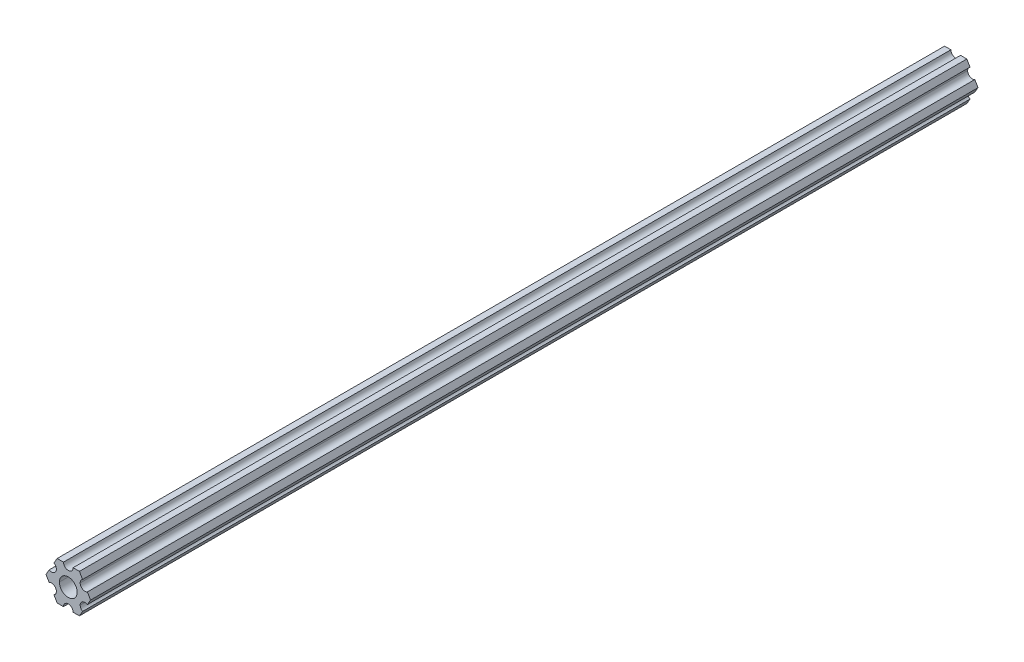
ISO-10303-21;
HEADER;
FILE_DESCRIPTION(('STEP AP214'),'2;1');
FILE_NAME('part.step','',(''),(''),'','','');
FILE_SCHEMA(('AUTOMOTIVE_DESIGN { 1 0 10303 214 1 1 1 1 }'));
ENDSEC;
DATA;
#1=APPLICATION_CONTEXT('core data for automotive mechanical design processes');
#2=APPLICATION_PROTOCOL_DEFINITION('international standard','automotive_design',2000,#1);
#3=PRODUCT_CONTEXT('',#1,'mechanical');
#4=PRODUCT('Part','Part','',(#3));
#5=PRODUCT_RELATED_PRODUCT_CATEGORY('part','',(#4));
#6=PRODUCT_DEFINITION_FORMATION('','',#4);
#7=PRODUCT_DEFINITION_CONTEXT('part definition',#1,'design');
#8=PRODUCT_DEFINITION('design','',#6,#7);
#9=PRODUCT_DEFINITION_SHAPE('','',#8);
#10=(LENGTH_UNIT() NAMED_UNIT(*) SI_UNIT(.MILLI.,.METRE.));
#11=(NAMED_UNIT(*) PLANE_ANGLE_UNIT() SI_UNIT($,.RADIAN.));
#12=(NAMED_UNIT(*) SI_UNIT($,.STERADIAN.) SOLID_ANGLE_UNIT());
#13=UNCERTAINTY_MEASURE_WITH_UNIT(LENGTH_MEASURE(1.E-05),#10,'distance_accuracy_value','');
#14=(GEOMETRIC_REPRESENTATION_CONTEXT(3) GLOBAL_UNCERTAINTY_ASSIGNED_CONTEXT((#13)) GLOBAL_UNIT_ASSIGNED_CONTEXT((#10,
#11,#12)) REPRESENTATION_CONTEXT('',''));
#15=CARTESIAN_POINT('',(0.,0.,0.));
#16=DIRECTION('',(0.,0.,1.));
#17=DIRECTION('',(1.,0.,0.));
#18=AXIS2_PLACEMENT_3D('',#15,#16,#17);
#19=CARTESIAN_POINT('',(0.,0.,304.8));
#20=DIRECTION('',(0.,0.,-1.));
#21=DIRECTION('',(-1.,0.,0.));
#22=AXIS2_PLACEMENT_3D('',#19,#20,#21);
#23=CYLINDRICAL_SURFACE('',#22,2.9337);
#24=DIRECTION('',(0.,0.,-1.));
#25=VECTOR('',#24,1.);
#26=CARTESIAN_POINT('',(2.9337,0.,304.8));
#27=LINE('',#26,#25);
#28=CARTESIAN_POINT('',(2.9337,0.,292.1));
#29=VERTEX_POINT('',#28);
#30=CARTESIAN_POINT('',(2.9337,0.,0.));
#31=VERTEX_POINT('',#30);
#32=EDGE_CURVE('E320',#29,#31,#27,.T.);
#33=ORIENTED_EDGE('',*,*,#32,.F.);
#34=CARTESIAN_POINT('',(0.,0.,292.1));
#35=DIRECTION('',(0.,0.,-1.));
#36=DIRECTION('',(-1.,0.,0.));
#37=AXIS2_PLACEMENT_3D('',#34,#35,#36);
#38=CIRCLE('',#37,2.9337);
#39=CARTESIAN_POINT('',(-2.9337,0.,292.1));
#40=VERTEX_POINT('',#39);
#41=EDGE_CURVE('E68',#29,#40,#38,.F.);
#42=ORIENTED_EDGE('',*,*,#41,.T.);
#43=DIRECTION('',(0.,0.,-1.));
#44=VECTOR('',#43,1.);
#45=CARTESIAN_POINT('',(-2.9337,0.,304.8));
#46=LINE('',#45,#44);
#47=CARTESIAN_POINT('',(-2.9337,0.,0.));
#48=VERTEX_POINT('',#47);
#49=EDGE_CURVE('E296',#40,#48,#46,.T.);
#50=ORIENTED_EDGE('',*,*,#49,.T.);
#51=CARTESIAN_POINT('',(0.,0.,0.));
#52=DIRECTION('',(0.,0.,1.));
#53=DIRECTION('',(1.,0.,0.));
#54=AXIS2_PLACEMENT_3D('',#51,#52,#53);
#55=CIRCLE('',#54,2.9337);
#56=EDGE_CURVE('E304',#31,#48,#55,.T.);
#57=ORIENTED_EDGE('',*,*,#56,.F.);
#58=EDGE_LOOP('',(#33,#42,#50,#57));
#59=FACE_BOUND('',#58,.T.);
#60=ADVANCED_FACE('F46',(#59),#23,.F.);
#61=CARTESIAN_POINT('',(5.49926150638082,-3.17499966684067,304.8));
#62=DIRECTION('',(0.,0.,-1.));
#63=DIRECTION('',(-1.,0.,0.));
#64=AXIS2_PLACEMENT_3D('',#61,#62,#63);
#65=CYLINDRICAL_SURFACE('',#64,1.5875);
#66=DIRECTION('',(0.,0.,-1.));
#67=VECTOR('',#66,1.);
#68=CARTESIAN_POINT('',(3.91176150638082,-3.17499966684067,304.8));
#69=LINE('',#68,#67);
#70=CARTESIAN_POINT('',(3.91176150638082,-3.17499966684067,292.1));
#71=VERTEX_POINT('',#70);
#72=CARTESIAN_POINT('',(3.91176150638082,-3.17499966684067,0.));
#73=VERTEX_POINT('',#72);
#74=EDGE_CURVE('E227',#71,#73,#69,.T.);
#75=ORIENTED_EDGE('',*,*,#74,.F.);
#76=CARTESIAN_POINT('',(5.49926150638082,-3.17499966684067,292.1));
#77=DIRECTION('',(0.,0.,-1.));
#78=DIRECTION('',(-1.,0.,0.));
#79=AXIS2_PLACEMENT_3D('',#76,#77,#78);
#80=CIRCLE('',#79,1.5875);
#81=CARTESIAN_POINT('',(4.70551158967065,-4.54981504343587,292.1));
#82=VERTEX_POINT('',#81);
#83=EDGE_CURVE('E61',#82,#71,#80,.T.);
#84=ORIENTED_EDGE('',*,*,#83,.F.);
#85=DIRECTION('',(0.,0.,-1.));
#86=VECTOR('',#85,1.);
#87=CARTESIAN_POINT('',(4.70551158967065,-4.54981504343587,304.8));
#88=LINE('',#87,#86);
#89=CARTESIAN_POINT('',(4.70551158967065,-4.54981504343587,0.));
#90=VERTEX_POINT('',#89);
#91=EDGE_CURVE('E54',#82,#90,#88,.T.);
#92=ORIENTED_EDGE('',*,*,#91,.T.);
#93=CARTESIAN_POINT('',(5.49926150638082,-3.17499966684067,0.));
#94=DIRECTION('',(0.,0.,-1.));
#95=DIRECTION('',(1.,0.,0.));
#96=AXIS2_PLACEMENT_3D('',#93,#94,#95);
#97=CIRCLE('',#96,1.5875);
#98=EDGE_CURVE('E334',#90,#73,#97,.T.);
#99=ORIENTED_EDGE('',*,*,#98,.T.);
#100=EDGE_LOOP('',(#75,#84,#92,#99));
#101=FACE_BOUND('',#100,.T.);
#102=ADVANCED_FACE('F224',(#101),#65,.F.);
#103=CARTESIAN_POINT('',(3.66617459405346,-6.34999977789375,304.8));
#104=DIRECTION('',(-0.86602543407573,0.499999947533941,0.));
#105=DIRECTION('',(0.,0.,1.));
#106=AXIS2_PLACEMENT_3D('',#103,#104,#105);
#107=PLANE('',#106);
#108=ORIENTED_EDGE('',*,*,#91,.F.);
#109=DIRECTION('',(-0.499999947533941,-0.86602543407573,0.));
#110=VECTOR('',#109,1.);
#111=CARTESIAN_POINT('',(5.49926150638086,-3.17499966684051,292.1));
#112=LINE('',#111,#110);
#113=CARTESIAN_POINT('',(3.66617459405346,-6.34999977789375,292.1));
#114=VERTEX_POINT('',#113);
#115=EDGE_CURVE('E214',#82,#114,#112,.T.);
#116=ORIENTED_EDGE('',*,*,#115,.T.);
#117=DIRECTION('',(0.,0.,-1.));
#118=VECTOR('',#117,1.);
#119=CARTESIAN_POINT('',(3.66617459405346,-6.34999977789375,304.8));
#120=LINE('',#119,#118);
#121=CARTESIAN_POINT('',(3.66617459405346,-6.34999977789375,0.));
#122=VERTEX_POINT('',#121);
#123=EDGE_CURVE('E234',#114,#122,#120,.T.);
#124=ORIENTED_EDGE('',*,*,#123,.T.);
#125=DIRECTION('',(0.499999947533941,0.86602543407573,0.));
#126=VECTOR('',#125,1.);
#127=CARTESIAN_POINT('',(3.66617459405346,-6.34999977789375,0.));
#128=LINE('',#127,#126);
#129=EDGE_CURVE('E232',#122,#90,#128,.T.);
#130=ORIENTED_EDGE('',*,*,#129,.T.);
#131=EDGE_LOOP('',(#108,#116,#124,#130));
#132=FACE_BOUND('',#131,.T.);
#133=ADVANCED_FACE('F230',(#132),#107,.F.);
#134=CARTESIAN_POINT('',(1.58750038469926,-6.34999990382518,304.8));
#135=DIRECTION('',(-6.05825721258438E-08,1.,0.));
#136=DIRECTION('',(0.,0.,1.));
#137=AXIS2_PLACEMENT_3D('',#134,#135,#136);
#138=PLANE('',#137);
#139=ORIENTED_EDGE('',*,*,#123,.F.);
#140=DIRECTION('',(-0.999999999999998,-6.05825729603773E-08,0.));
#141=VECTOR('',#140,1.);
#142=CARTESIAN_POINT('',(3.84699338298397E-07,-6.35000000000002,292.1));
#143=LINE('',#142,#141);
#144=CARTESIAN_POINT('',(1.58750038469926,-6.34999990382518,292.1));
#145=VERTEX_POINT('',#144);
#146=EDGE_CURVE('E217',#114,#145,#143,.T.);
#147=ORIENTED_EDGE('',*,*,#146,.T.);
#148=DIRECTION('',(0.,0.,-1.));
#149=VECTOR('',#148,1.);
#150=CARTESIAN_POINT('',(1.58750038469926,-6.34999990382518,304.8));
#151=LINE('',#150,#149);
#152=CARTESIAN_POINT('',(1.58750038469926,-6.34999990382518,0.));
#153=VERTEX_POINT('',#152);
#154=EDGE_CURVE('E236',#145,#153,#151,.T.);
#155=ORIENTED_EDGE('',*,*,#154,.T.);
#156=DIRECTION('',(1.,6.05825721258438E-08,0.));
#157=VECTOR('',#156,1.);
#158=CARTESIAN_POINT('',(1.58750038469926,-6.34999990382518,0.));
#159=LINE('',#158,#157);
#160=EDGE_CURVE('E338',#153,#122,#159,.T.);
#161=ORIENTED_EDGE('',*,*,#160,.T.);
#162=EDGE_LOOP('',(#139,#147,#155,#161));
#163=FACE_BOUND('',#162,.T.);
#164=ADVANCED_FACE('F438',(#163),#138,.F.);
#165=CARTESIAN_POINT('',(3.8469926204343E-07,-6.35,304.8));
#166=DIRECTION('',(0.,0.,-1.));
#167=DIRECTION('',(-1.,0.,0.));
#168=AXIS2_PLACEMENT_3D('',#165,#166,#167);
#169=CYLINDRICAL_SURFACE('',#168,1.5875);
#170=ORIENTED_EDGE('',*,*,#154,.F.);
#171=CARTESIAN_POINT('',(3.84699262029331E-07,-6.35,292.1));
#172=DIRECTION('',(0.,0.,-1.));
#173=DIRECTION('',(-1.,0.,0.));
#174=AXIS2_PLACEMENT_3D('',#171,#172,#173);
#175=CIRCLE('',#174,1.5875);
#176=CARTESIAN_POINT('',(-1.58749961530073,-6.35000009617482,292.1));
#177=VERTEX_POINT('',#176);
#178=EDGE_CURVE('E444',#177,#145,#175,.T.);
#179=ORIENTED_EDGE('',*,*,#178,.F.);
#180=DIRECTION('',(0.,0.,-1.));
#181=VECTOR('',#180,1.);
#182=CARTESIAN_POINT('',(-1.58749961530073,-6.35000009617482,304.8));
#183=LINE('',#182,#181);
#184=CARTESIAN_POINT('',(-1.58749961530073,-6.35000009617482,0.));
#185=VERTEX_POINT('',#184);
#186=EDGE_CURVE('E241',#177,#185,#183,.T.);
#187=ORIENTED_EDGE('',*,*,#186,.T.);
#188=CARTESIAN_POINT('',(3.8469926204343E-07,-6.35,0.));
#189=DIRECTION('',(0.,0.,-1.));
#190=DIRECTION('',(1.,0.,0.));
#191=AXIS2_PLACEMENT_3D('',#188,#189,#190);
#192=CIRCLE('',#191,1.5875);
#193=EDGE_CURVE('E315',#185,#153,#192,.T.);
#194=ORIENTED_EDGE('',*,*,#193,.T.);
#195=EDGE_LOOP('',(#170,#179,#187,#194));
#196=FACE_BOUND('',#195,.T.);
#197=ADVANCED_FACE('F442',(#196),#169,.F.);
#198=CARTESIAN_POINT('',(-3.66617382465481,-6.35000022210628,304.8));
#199=DIRECTION('',(-6.05825854783851E-08,1.,0.));
#200=DIRECTION('',(0.,0.,1.));
#201=AXIS2_PLACEMENT_3D('',#198,#199,#200);
#202=PLANE('',#201);
#203=ORIENTED_EDGE('',*,*,#186,.F.);
#204=DIRECTION('',(-0.999999999999998,-6.05825863129187E-08,0.));
#205=VECTOR('',#204,1.);
#206=CARTESIAN_POINT('',(3.84699423087032E-07,-6.34999999999996,292.1));
#207=LINE('',#206,#205);
#208=CARTESIAN_POINT('',(-3.6661738246548,-6.35000022210628,292.1));
#209=VERTEX_POINT('',#208);
#210=EDGE_CURVE('E389',#177,#209,#207,.T.);
#211=ORIENTED_EDGE('',*,*,#210,.T.);
#212=DIRECTION('',(0.,0.,-1.));
#213=VECTOR('',#212,1.);
#214=CARTESIAN_POINT('',(-3.66617382465481,-6.35000022210628,304.8));
#215=LINE('',#214,#213);
#216=CARTESIAN_POINT('',(-3.66617382465481,-6.35000022210628,0.));
#217=VERTEX_POINT('',#216);
#218=EDGE_CURVE('E243',#209,#217,#215,.T.);
#219=ORIENTED_EDGE('',*,*,#218,.T.);
#220=DIRECTION('',(1.,6.05825854783851E-08,0.));
#221=VECTOR('',#220,1.);
#222=CARTESIAN_POINT('',(-3.66617382465481,-6.35000022210628,0.));
#223=LINE('',#222,#221);
#224=EDGE_CURVE('E311',#217,#185,#223,.T.);
#225=ORIENTED_EDGE('',*,*,#224,.T.);
#226=EDGE_LOOP('',(#203,#211,#219,#225));
#227=FACE_BOUND('',#226,.T.);
#228=ADVANCED_FACE('F447',(#227),#202,.F.);
#229=CARTESIAN_POINT('',(-4.70551103839172,-4.54981561357972,304.8));
#230=DIRECTION('',(0.866025373493152,0.500000052466045,0.));
#231=DIRECTION('',(0.,0.,-1.));
#232=AXIS2_PLACEMENT_3D('',#229,#230,#231);
#233=PLANE('',#232);
#234=ORIENTED_EDGE('',*,*,#218,.F.);
#235=DIRECTION('',(-0.500000052466043,0.866025373493153,0.));
#236=VECTOR('',#235,1.);
#237=CARTESIAN_POINT('',(-5.49926112168154,-3.17500033315938,292.1));
#238=LINE('',#237,#236);
#239=CARTESIAN_POINT('',(-4.70551103839172,-4.54981561357972,292.1));
#240=VERTEX_POINT('',#239);
#241=EDGE_CURVE('E385',#209,#240,#238,.T.);
#242=ORIENTED_EDGE('',*,*,#241,.T.);
#243=DIRECTION('',(0.,0.,-1.));
#244=VECTOR('',#243,1.);
#245=CARTESIAN_POINT('',(-4.70551103839172,-4.54981561357972,304.8));
#246=LINE('',#245,#244);
#247=CARTESIAN_POINT('',(-4.70551103839172,-4.54981561357972,0.));
#248=VERTEX_POINT('',#247);
#249=EDGE_CURVE('E250',#240,#248,#246,.T.);
#250=ORIENTED_EDGE('',*,*,#249,.T.);
#251=DIRECTION('',(0.500000052466045,-0.866025373493152,0.));
#252=VECTOR('',#251,1.);
#253=CARTESIAN_POINT('',(-4.70551103839172,-4.54981561357972,0.));
#254=LINE('',#253,#252);
#255=EDGE_CURVE('E294',#248,#217,#254,.T.);
#256=ORIENTED_EDGE('',*,*,#255,.T.);
#257=EDGE_LOOP('',(#234,#242,#250,#256));
#258=FACE_BOUND('',#257,.T.);
#259=ADVANCED_FACE('F450',(#258),#233,.F.);
#260=CARTESIAN_POINT('',(-5.49926112168156,-3.17500033315934,304.8));
#261=DIRECTION('',(0.,0.,-1.));
#262=DIRECTION('',(-1.,0.,0.));
#263=AXIS2_PLACEMENT_3D('',#260,#261,#262);
#264=CYLINDRICAL_SURFACE('',#263,1.5875);
#265=ORIENTED_EDGE('',*,*,#249,.F.);
#266=CARTESIAN_POINT('',(-5.49926112168156,-3.17500033315934,292.1));
#267=DIRECTION('',(0.,0.,-1.));
#268=DIRECTION('',(-1.,0.,0.));
#269=AXIS2_PLACEMENT_3D('',#266,#267,#268);
#270=CIRCLE('',#269,1.5875);
#271=CARTESIAN_POINT('',(-6.29301120497141,-1.80018505273897,292.1));
#272=VERTEX_POINT('',#271);
#273=EDGE_CURVE('E383',#272,#240,#270,.T.);
#274=ORIENTED_EDGE('',*,*,#273,.F.);
#275=DIRECTION('',(0.,0.,-1.));
#276=VECTOR('',#275,1.);
#277=CARTESIAN_POINT('',(-6.29301120497141,-1.80018505273897,304.8));
#278=LINE('',#277,#276);
#279=CARTESIAN_POINT('',(-6.29301120497141,-1.80018505273897,0.));
#280=VERTEX_POINT('',#279);
#281=EDGE_CURVE('E252',#272,#280,#278,.T.);
#282=ORIENTED_EDGE('',*,*,#281,.T.);
#283=CARTESIAN_POINT('',(-5.49926112168156,-3.17500033315934,0.));
#284=DIRECTION('',(0.,0.,-1.));
#285=DIRECTION('',(1.,0.,0.));
#286=AXIS2_PLACEMENT_3D('',#283,#284,#285);
#287=CIRCLE('',#286,1.5875);
#288=EDGE_CURVE('E286',#280,#248,#287,.T.);
#289=ORIENTED_EDGE('',*,*,#288,.T.);
#290=EDGE_LOOP('',(#265,#274,#282,#289));
#291=FACE_BOUND('',#290,.T.);
#292=ADVANCED_FACE('F381',(#291),#264,.F.);
#293=CARTESIAN_POINT('',(-7.33234841870827,-4.44212523790841E-07,304.8));
#294=DIRECTION('',(0.866025373493151,0.500000052466045,0.));
#295=DIRECTION('',(0.,0.,-1.));
#296=AXIS2_PLACEMENT_3D('',#293,#294,#295);
#297=PLANE('',#296);
#298=ORIENTED_EDGE('',*,*,#281,.F.);
#299=DIRECTION('',(-0.500000052466048,0.866025373493149,0.));
#300=VECTOR('',#299,1.);
#301=CARTESIAN_POINT('',(-5.49926112168151,-3.17500033315942,292.1));
#302=LINE('',#301,#300);
#303=CARTESIAN_POINT('',(-7.33234841870827,-4.44212523535714E-07,292.1));
#304=VERTEX_POINT('',#303);
#305=EDGE_CURVE('E367',#272,#304,#302,.T.);
#306=ORIENTED_EDGE('',*,*,#305,.T.);
#307=DIRECTION('',(0.,0.,-1.));
#308=VECTOR('',#307,1.);
#309=CARTESIAN_POINT('',(-7.33234841870827,-4.44212523790841E-07,304.8));
#310=LINE('',#309,#308);
#311=CARTESIAN_POINT('',(-7.33234841870827,-4.44212523790841E-07,0.));
#312=VERTEX_POINT('',#311);
#313=EDGE_CURVE('E289',#304,#312,#310,.T.);
#314=ORIENTED_EDGE('',*,*,#313,.T.);
#315=DIRECTION('',(0.500000052466045,-0.866025373493151,0.));
#316=VECTOR('',#315,1.);
#317=CARTESIAN_POINT('',(-7.33234841870827,-4.44212523790841E-07,0.));
#318=LINE('',#317,#316);
#319=EDGE_CURVE('E249',#312,#280,#318,.T.);
#320=ORIENTED_EDGE('',*,*,#319,.T.);
#321=EDGE_LOOP('',(#298,#306,#314,#320));
#322=FACE_BOUND('',#321,.T.);
#323=ADVANCED_FACE('F364',(#322),#297,.F.);
#324=CARTESIAN_POINT('',(-6.29301142309098,1.80018429024547,304.8));
#325=DIRECTION('',(0.866025434075724,-0.499999947533952,0.));
#326=DIRECTION('',(0.,0.,-1.));
#327=AXIS2_PLACEMENT_3D('',#324,#325,#326);
#328=PLANE('',#327);
#329=ORIENTED_EDGE('',*,*,#313,.F.);
#330=DIRECTION('',(0.499999947533955,0.866025434075722,0.));
#331=VECTOR('',#330,1.);
#332=CARTESIAN_POINT('',(-5.49926150638086,3.17499966684062,292.1));
#333=LINE('',#332,#331);
#334=CARTESIAN_POINT('',(-6.29301142309098,1.80018429024546,292.1));
#335=VERTEX_POINT('',#334);
#336=EDGE_CURVE('E387',#304,#335,#333,.T.);
#337=ORIENTED_EDGE('',*,*,#336,.T.);
#338=DIRECTION('',(0.,0.,-1.));
#339=VECTOR('',#338,1.);
#340=CARTESIAN_POINT('',(-6.29301142309098,1.80018429024547,304.8));
#341=LINE('',#340,#339);
#342=CARTESIAN_POINT('',(-6.29301142309098,1.80018429024547,0.));
#343=VERTEX_POINT('',#342);
#344=EDGE_CURVE('E287',#335,#343,#341,.T.);
#345=ORIENTED_EDGE('',*,*,#344,.T.);
#346=DIRECTION('',(-0.499999947533951,-0.866025434075724,0.));
#347=VECTOR('',#346,1.);
#348=CARTESIAN_POINT('',(-6.29301142309098,1.80018429024547,0.));
#349=LINE('',#348,#347);
#350=EDGE_CURVE('E244',#343,#312,#349,.T.);
#351=ORIENTED_EDGE('',*,*,#350,.T.);
#352=EDGE_LOOP('',(#329,#337,#345,#351));
#353=FACE_BOUND('',#352,.T.);
#354=ADVANCED_FACE('F371',(#353),#328,.F.);
#355=CARTESIAN_POINT('',(-5.49926150638082,3.17499966684067,304.8));
#356=DIRECTION('',(0.,0.,-1.));
#357=DIRECTION('',(-1.,0.,0.));
#358=AXIS2_PLACEMENT_3D('',#355,#356,#357);
#359=CYLINDRICAL_SURFACE('',#358,1.5875);
#360=ORIENTED_EDGE('',*,*,#344,.F.);
#361=CARTESIAN_POINT('',(-5.49926150638082,3.17499966684067,292.1));
#362=DIRECTION('',(0.,0.,-1.));
#363=DIRECTION('',(-1.,0.,0.));
#364=AXIS2_PLACEMENT_3D('',#361,#362,#363);
#365=CIRCLE('',#364,1.5875);
#366=CARTESIAN_POINT('',(-4.70551158967065,4.54981504343587,292.1));
#367=VERTEX_POINT('',#366);
#368=EDGE_CURVE('E394',#367,#335,#365,.T.);
#369=ORIENTED_EDGE('',*,*,#368,.F.);
#370=DIRECTION('',(0.,0.,-1.));
#371=VECTOR('',#370,1.);
#372=CARTESIAN_POINT('',(-4.70551158967065,4.54981504343587,304.8));
#373=LINE('',#372,#371);
#374=CARTESIAN_POINT('',(-4.70551158967065,4.54981504343587,0.));
#375=VERTEX_POINT('',#374);
#376=EDGE_CURVE('E290',#367,#375,#373,.T.);
#377=ORIENTED_EDGE('',*,*,#376,.T.);
#378=CARTESIAN_POINT('',(-5.49926150638082,3.17499966684067,0.));
#379=DIRECTION('',(0.,0.,-1.));
#380=DIRECTION('',(1.,0.,0.));
#381=AXIS2_PLACEMENT_3D('',#378,#379,#380);
#382=CIRCLE('',#381,1.5875);
#383=EDGE_CURVE('E248',#375,#343,#382,.T.);
#384=ORIENTED_EDGE('',*,*,#383,.T.);
#385=EDGE_LOOP('',(#360,#369,#377,#384));
#386=FACE_BOUND('',#385,.T.);
#387=ADVANCED_FACE('F493',(#386),#359,.F.);
#388=CARTESIAN_POINT('',(-3.66617459405349,6.3499997778937,304.8));
#389=DIRECTION('',(0.866025434075729,-0.499999947533942,0.));
#390=DIRECTION('',(0.,0.,-1.));
#391=AXIS2_PLACEMENT_3D('',#388,#389,#390);
#392=PLANE('',#391);
#393=ORIENTED_EDGE('',*,*,#376,.F.);
#394=DIRECTION('',(0.499999947533943,0.866025434075729,0.));
#395=VECTOR('',#394,1.);
#396=CARTESIAN_POINT('',(-5.49926150638086,3.17499966684052,292.1));
#397=LINE('',#396,#395);
#398=CARTESIAN_POINT('',(-3.66617459405349,6.3499997778937,292.1));
#399=VERTEX_POINT('',#398);
#400=EDGE_CURVE('E396',#367,#399,#397,.T.);
#401=ORIENTED_EDGE('',*,*,#400,.T.);
#402=DIRECTION('',(0.,0.,-1.));
#403=VECTOR('',#402,1.);
#404=CARTESIAN_POINT('',(-3.66617459405349,6.3499997778937,304.8));
#405=LINE('',#404,#403);
#406=CARTESIAN_POINT('',(-3.66617459405349,6.3499997778937,0.));
#407=VERTEX_POINT('',#406);
#408=EDGE_CURVE('E307',#399,#407,#405,.T.);
#409=ORIENTED_EDGE('',*,*,#408,.T.);
#410=DIRECTION('',(-0.499999947533943,-0.866025434075729,0.));
#411=VECTOR('',#410,1.);
#412=CARTESIAN_POINT('',(-3.66617459405349,6.3499997778937,0.));
#413=LINE('',#412,#411);
#414=EDGE_CURVE('E258',#407,#375,#413,.T.);
#415=ORIENTED_EDGE('',*,*,#414,.T.);
#416=EDGE_LOOP('',(#393,#401,#409,#415));
#417=FACE_BOUND('',#416,.T.);
#418=ADVANCED_FACE('F489',(#417),#392,.F.);
#419=CARTESIAN_POINT('',(-1.58750038469926,6.34999990382518,304.8));
#420=DIRECTION('',(6.05825963273174E-08,-1.,0.));
#421=DIRECTION('',(0.,0.,-1.));
#422=AXIS2_PLACEMENT_3D('',#419,#420,#421);
#423=PLANE('',#422);
#424=ORIENTED_EDGE('',*,*,#408,.F.);
#425=DIRECTION('',(0.999999999999998,6.05826013345191E-08,0.));
#426=VECTOR('',#425,1.);
#427=CARTESIAN_POINT('',(-3.84699518474201E-07,6.35000000000007,292.1));
#428=LINE('',#427,#426);
#429=CARTESIAN_POINT('',(-1.58750038469926,6.34999990382519,292.1));
#430=VERTEX_POINT('',#429);
#431=EDGE_CURVE('E399',#399,#430,#428,.T.);
#432=ORIENTED_EDGE('',*,*,#431,.T.);
#433=DIRECTION('',(0.,0.,-1.));
#434=VECTOR('',#433,1.);
#435=CARTESIAN_POINT('',(-1.58750038469926,6.34999990382519,304.8));
#436=LINE('',#435,#434);
#437=CARTESIAN_POINT('',(-1.58750038469926,6.34999990382519,0.));
#438=VERTEX_POINT('',#437);
#439=EDGE_CURVE('E239',#430,#438,#436,.T.);
#440=ORIENTED_EDGE('',*,*,#439,.T.);
#441=DIRECTION('',(-1.,-6.05825963273174E-08,0.));
#442=VECTOR('',#441,1.);
#443=CARTESIAN_POINT('',(-1.58750038469926,6.34999990382518,0.));
#444=LINE('',#443,#442);
#445=EDGE_CURVE('E253',#438,#407,#444,.T.);
#446=ORIENTED_EDGE('',*,*,#445,.T.);
#447=EDGE_LOOP('',(#424,#432,#440,#446));
#448=FACE_BOUND('',#447,.T.);
#449=ADVANCED_FACE('F492',(#448),#423,.F.);
#450=CARTESIAN_POINT('',(-3.84699260060323E-07,6.35,304.8));
#451=DIRECTION('',(0.,0.,-1.));
#452=DIRECTION('',(-1.,0.,0.));
#453=AXIS2_PLACEMENT_3D('',#450,#451,#452);
#454=CYLINDRICAL_SURFACE('',#453,1.5875);
#455=ORIENTED_EDGE('',*,*,#439,.F.);
#456=CARTESIAN_POINT('',(-3.84699260294608E-07,6.35,292.1));
#457=DIRECTION('',(0.,0.,-1.));
#458=DIRECTION('',(-1.,0.,0.));
#459=AXIS2_PLACEMENT_3D('',#456,#457,#458);
#460=CIRCLE('',#459,1.5875);
#461=CARTESIAN_POINT('',(1.58749961530074,6.35000009617482,292.1));
#462=VERTEX_POINT('',#461);
#463=EDGE_CURVE('E402',#462,#430,#460,.T.);
#464=ORIENTED_EDGE('',*,*,#463,.F.);
#465=DIRECTION('',(0.,0.,-1.));
#466=VECTOR('',#465,1.);
#467=CARTESIAN_POINT('',(1.58749961530074,6.35000009617482,304.8));
#468=LINE('',#467,#466);
#469=CARTESIAN_POINT('',(1.58749961530074,6.35000009617482,0.));
#470=VERTEX_POINT('',#469);
#471=EDGE_CURVE('E339',#462,#470,#468,.T.);
#472=ORIENTED_EDGE('',*,*,#471,.T.);
#473=CARTESIAN_POINT('',(-3.84699260060323E-07,6.35,0.));
#474=DIRECTION('',(0.,0.,-1.));
#475=DIRECTION('',(1.,0.,0.));
#476=AXIS2_PLACEMENT_3D('',#473,#474,#475);
#477=CIRCLE('',#476,1.5875);
#478=EDGE_CURVE('E257',#470,#438,#477,.T.);
#479=ORIENTED_EDGE('',*,*,#478,.T.);
#480=EDGE_LOOP('',(#455,#464,#472,#479));
#481=FACE_BOUND('',#480,.T.);
#482=ADVANCED_FACE('F504',(#481),#454,.F.);
#483=CARTESIAN_POINT('',(3.66617382465481,6.35000022210627,304.8));
#484=DIRECTION('',(6.05825850611185E-08,-1.,0.));
#485=DIRECTION('',(0.,0.,-1.));
#486=AXIS2_PLACEMENT_3D('',#483,#484,#485);
#487=PLANE('',#486);
#488=ORIENTED_EDGE('',*,*,#471,.F.);
#489=DIRECTION('',(0.999999999999998,6.05825813057172E-08,0.));
#490=VECTOR('',#489,1.);
#491=CARTESIAN_POINT('',(-3.84699391291303E-07,6.34999999999997,292.1));
#492=LINE('',#491,#490);
#493=CARTESIAN_POINT('',(3.66617382465481,6.35000022210627,292.1));
#494=VERTEX_POINT('',#493);
#495=EDGE_CURVE('E404',#462,#494,#492,.T.);
#496=ORIENTED_EDGE('',*,*,#495,.T.);
#497=DIRECTION('',(0.,0.,-1.));
#498=VECTOR('',#497,1.);
#499=CARTESIAN_POINT('',(3.66617382465481,6.35000022210627,304.8));
#500=LINE('',#499,#498);
#501=CARTESIAN_POINT('',(3.66617382465481,6.35000022210627,0.));
#502=VERTEX_POINT('',#501);
#503=EDGE_CURVE('E341',#494,#502,#500,.T.);
#504=ORIENTED_EDGE('',*,*,#503,.T.);
#505=DIRECTION('',(-1.,-6.05825850611185E-08,0.));
#506=VECTOR('',#505,1.);
#507=CARTESIAN_POINT('',(3.66617382465481,6.35000022210627,0.));
#508=LINE('',#507,#506);
#509=EDGE_CURVE('E319',#502,#470,#508,.T.);
#510=ORIENTED_EDGE('',*,*,#509,.T.);
#511=EDGE_LOOP('',(#488,#496,#504,#510));
#512=FACE_BOUND('',#511,.T.);
#513=ADVANCED_FACE('F500',(#512),#487,.F.);
#514=CARTESIAN_POINT('',(4.70551103839172,4.54981561357972,304.8));
#515=DIRECTION('',(-0.866025373493151,-0.500000052466046,0.));
#516=DIRECTION('',(-0.500000052466046,0.866025373493151,0.));
#517=AXIS2_PLACEMENT_3D('',#514,#515,#516);
#518=PLANE('',#517);
#519=ORIENTED_EDGE('',*,*,#503,.F.);
#520=DIRECTION('',(0.500000052466045,-0.866025373493151,0.));
#521=VECTOR('',#520,1.);
#522=CARTESIAN_POINT('',(5.49926112168153,3.1750003331594,292.1));
#523=LINE('',#522,#521);
#524=CARTESIAN_POINT('',(4.70551103839172,4.54981561357972,292.1));
#525=VERTEX_POINT('',#524);
#526=EDGE_CURVE('E407',#494,#525,#523,.T.);
#527=ORIENTED_EDGE('',*,*,#526,.T.);
#528=DIRECTION('',(0.,0.,-1.));
#529=VECTOR('',#528,1.);
#530=CARTESIAN_POINT('',(4.70551103839172,4.54981561357972,304.8));
#531=LINE('',#530,#529);
#532=CARTESIAN_POINT('',(4.70551103839172,4.54981561357972,0.));
#533=VERTEX_POINT('',#532);
#534=EDGE_CURVE('E262',#525,#533,#531,.T.);
#535=ORIENTED_EDGE('',*,*,#534,.T.);
#536=DIRECTION('',(-0.500000052466046,0.866025373493151,0.));
#537=VECTOR('',#536,1.);
#538=CARTESIAN_POINT('',(4.70551103839172,4.54981561357972,0.));
#539=LINE('',#538,#537);
#540=EDGE_CURVE('E310',#533,#502,#539,.T.);
#541=ORIENTED_EDGE('',*,*,#540,.T.);
#542=EDGE_LOOP('',(#519,#527,#535,#541));
#543=FACE_BOUND('',#542,.T.);
#544=ADVANCED_FACE('F484',(#543),#518,.F.);
#545=CARTESIAN_POINT('',(5.49926112168156,3.17500033315934,304.8));
#546=DIRECTION('',(0.,0.,-1.));
#547=DIRECTION('',(-1.,0.,0.));
#548=AXIS2_PLACEMENT_3D('',#545,#546,#547);
#549=CYLINDRICAL_SURFACE('',#548,1.5875);
#550=DIRECTION('',(0.,0.,-1.));
#551=VECTOR('',#550,1.);
#552=CARTESIAN_POINT('',(3.91176112168156,3.17500033315934,304.8));
#553=LINE('',#552,#551);
#554=CARTESIAN_POINT('',(3.91176112168156,3.17500033315934,292.1));
#555=VERTEX_POINT('',#554);
#556=CARTESIAN_POINT('',(3.91176112168156,3.17500033315934,0.));
#557=VERTEX_POINT('',#556);
#558=EDGE_CURVE('E263',#555,#557,#553,.T.);
#559=ORIENTED_EDGE('',*,*,#558,.F.);
#560=CARTESIAN_POINT('',(5.49926112168156,3.17500033315934,292.1));
#561=DIRECTION('',(0.,0.,-1.));
#562=DIRECTION('',(-1.,0.,0.));
#563=AXIS2_PLACEMENT_3D('',#560,#561,#562);
#564=CIRCLE('',#563,1.5875);
#565=CARTESIAN_POINT('',(6.29301120497139,1.80018505273894,292.1));
#566=VERTEX_POINT('',#565);
#567=EDGE_CURVE('E411',#566,#555,#564,.T.);
#568=ORIENTED_EDGE('',*,*,#567,.F.);
#569=DIRECTION('',(0.,0.,-1.));
#570=VECTOR('',#569,1.);
#571=CARTESIAN_POINT('',(6.29301120497139,1.80018505273894,304.8));
#572=LINE('',#571,#570);
#573=CARTESIAN_POINT('',(6.29301120497139,1.80018505273894,0.));
#574=VERTEX_POINT('',#573);
#575=EDGE_CURVE('E343',#566,#574,#572,.T.);
#576=ORIENTED_EDGE('',*,*,#575,.T.);
#577=CARTESIAN_POINT('',(5.49926112168156,3.17500033315934,0.));
#578=DIRECTION('',(0.,0.,-1.));
#579=DIRECTION('',(1.,0.,0.));
#580=AXIS2_PLACEMENT_3D('',#577,#578,#579);
#581=CIRCLE('',#580,1.5875);
#582=EDGE_CURVE('E305',#574,#557,#581,.T.);
#583=ORIENTED_EDGE('',*,*,#582,.T.);
#584=EDGE_LOOP('',(#559,#568,#576,#583));
#585=FACE_BOUND('',#584,.T.);
#586=ADVANCED_FACE('F479',(#585),#549,.F.);
#587=CARTESIAN_POINT('',(7.33234841870827,4.44212519169686E-07,304.8));
#588=DIRECTION('',(-0.866025373493145,-0.500000052466057,0.));
#589=DIRECTION('',(-0.500000052466057,0.866025373493145,0.));
#590=AXIS2_PLACEMENT_3D('',#587,#588,#589);
#591=PLANE('',#590);
#592=ORIENTED_EDGE('',*,*,#575,.F.);
#593=DIRECTION('',(0.500000052466059,-0.866025373493143,0.));
#594=VECTOR('',#593,1.);
#595=CARTESIAN_POINT('',(5.49926112168144,3.17500033315946,292.1));
#596=LINE('',#595,#594);
#597=CARTESIAN_POINT('',(7.33234841870827,4.44212519632586E-07,292.1));
#598=VERTEX_POINT('',#597);
#599=EDGE_CURVE('E413',#566,#598,#596,.T.);
#600=ORIENTED_EDGE('',*,*,#599,.T.);
#601=DIRECTION('',(0.,0.,-1.));
#602=VECTOR('',#601,1.);
#603=CARTESIAN_POINT('',(7.33234841870827,4.44212519169686E-07,304.8));
#604=LINE('',#603,#602);
#605=CARTESIAN_POINT('',(7.33234841870827,4.44212519169686E-07,0.));
#606=VERTEX_POINT('',#605);
#607=EDGE_CURVE('E344',#598,#606,#604,.T.);
#608=ORIENTED_EDGE('',*,*,#607,.T.);
#609=DIRECTION('',(-0.500000052466056,0.866025373493145,0.));
#610=VECTOR('',#609,1.);
#611=CARTESIAN_POINT('',(7.33234841870827,4.44212519169686E-07,0.));
#612=LINE('',#611,#610);
#613=EDGE_CURVE('E300',#606,#574,#612,.T.);
#614=ORIENTED_EDGE('',*,*,#613,.T.);
#615=EDGE_LOOP('',(#592,#600,#608,#614));
#616=FACE_BOUND('',#615,.T.);
#617=ADVANCED_FACE('F428',(#616),#591,.F.);
#618=CARTESIAN_POINT('',(6.29301142309098,-1.80018429024546,304.8));
#619=DIRECTION('',(-0.866025434075723,0.499999947533953,0.));
#620=DIRECTION('',(0.,0.,1.));
#621=AXIS2_PLACEMENT_3D('',#618,#619,#620);
#622=PLANE('',#621);
#623=ORIENTED_EDGE('',*,*,#607,.F.);
#624=DIRECTION('',(-0.499999947533957,-0.866025434075721,0.));
#625=VECTOR('',#624,1.);
#626=CARTESIAN_POINT('',(5.49926150638084,-3.17499966684063,292.1));
#627=LINE('',#626,#625);
#628=CARTESIAN_POINT('',(6.29301142309098,-1.80018429024546,292.1));
#629=VERTEX_POINT('',#628);
#630=EDGE_CURVE('E416',#598,#629,#627,.T.);
#631=ORIENTED_EDGE('',*,*,#630,.T.);
#632=DIRECTION('',(0.,0.,-1.));
#633=VECTOR('',#632,1.);
#634=CARTESIAN_POINT('',(6.29301142309098,-1.80018429024546,304.8));
#635=LINE('',#634,#633);
#636=CARTESIAN_POINT('',(6.29301142309098,-1.80018429024546,0.));
#637=VERTEX_POINT('',#636);
#638=EDGE_CURVE('E271',#629,#637,#635,.T.);
#639=ORIENTED_EDGE('',*,*,#638,.T.);
#640=DIRECTION('',(0.499999947533953,0.866025434075723,0.));
#641=VECTOR('',#640,1.);
#642=CARTESIAN_POINT('',(6.29301142309098,-1.80018429024546,0.));
#643=LINE('',#642,#641);
#644=EDGE_CURVE('E269',#637,#606,#643,.T.);
#645=ORIENTED_EDGE('',*,*,#644,.T.);
#646=EDGE_LOOP('',(#623,#631,#639,#645));
#647=FACE_BOUND('',#646,.T.);
#648=ADVANCED_FACE('F432',(#647),#622,.F.);
#649=CARTESIAN_POINT('',(5.49926112168156,3.17500033315934,0.));
#650=DIRECTION('',(0.,0.,1.));
#651=DIRECTION('',(1.,0.,0.));
#652=AXIS2_PLACEMENT_3D('',#649,#650,#651);
#653=PLANE('',#652);
#654=CARTESIAN_POINT('',(0.,0.,0.));
#655=DIRECTION('',(0.,0.,1.));
#656=DIRECTION('',(1.,0.,0.));
#657=AXIS2_PLACEMENT_3D('',#654,#655,#656);
#658=CIRCLE('',#657,2.9337);
#659=EDGE_CURVE('E322',#48,#31,#658,.T.);
#660=ORIENTED_EDGE('',*,*,#659,.T.);
#661=ORIENTED_EDGE('',*,*,#56,.T.);
#662=EDGE_LOOP('',(#660,#661));
#663=FACE_BOUND('',#662,.T.);
#664=ORIENTED_EDGE('',*,*,#644,.F.);
#665=CARTESIAN_POINT('',(5.49926150638082,-3.17499966684067,0.));
#666=DIRECTION('',(0.,0.,-1.));
#667=DIRECTION('',(1.,0.,0.));
#668=AXIS2_PLACEMENT_3D('',#665,#666,#667);
#669=CIRCLE('',#668,1.5875);
#670=EDGE_CURVE('E276',#73,#637,#669,.T.);
#671=ORIENTED_EDGE('',*,*,#670,.F.);
#672=ORIENTED_EDGE('',*,*,#98,.F.);
#673=ORIENTED_EDGE('',*,*,#129,.F.);
#674=ORIENTED_EDGE('',*,*,#160,.F.);
#675=ORIENTED_EDGE('',*,*,#193,.F.);
#676=ORIENTED_EDGE('',*,*,#224,.F.);
#677=ORIENTED_EDGE('',*,*,#255,.F.);
#678=ORIENTED_EDGE('',*,*,#288,.F.);
#679=ORIENTED_EDGE('',*,*,#319,.F.);
#680=ORIENTED_EDGE('',*,*,#350,.F.);
#681=ORIENTED_EDGE('',*,*,#383,.F.);
#682=ORIENTED_EDGE('',*,*,#414,.F.);
#683=ORIENTED_EDGE('',*,*,#445,.F.);
#684=ORIENTED_EDGE('',*,*,#478,.F.);
#685=ORIENTED_EDGE('',*,*,#509,.F.);
#686=ORIENTED_EDGE('',*,*,#540,.F.);
#687=CARTESIAN_POINT('',(5.49926112168156,3.17500033315934,0.));
#688=DIRECTION('',(0.,0.,-1.));
#689=DIRECTION('',(1.,0.,0.));
#690=AXIS2_PLACEMENT_3D('',#687,#688,#689);
#691=CIRCLE('',#690,1.5875);
#692=EDGE_CURVE('E259',#557,#533,#691,.T.);
#693=ORIENTED_EDGE('',*,*,#692,.F.);
#694=ORIENTED_EDGE('',*,*,#582,.F.);
#695=ORIENTED_EDGE('',*,*,#613,.F.);
#696=EDGE_LOOP('',(#664,#671,#672,#673,#674,#675,#676,#677,#678,#679,#680,#681,#682,#683,#684,
#685,#686,#693,#694,#695));
#697=FACE_BOUND('',#696,.T.);
#698=ADVANCED_FACE('F376',(#663,#697),#653,.F.);
#699=CARTESIAN_POINT('',(5.49926112168156,3.17500033315934,304.8));
#700=DIRECTION('',(0.,0.,-1.));
#701=DIRECTION('',(-1.,0.,0.));
#702=AXIS2_PLACEMENT_3D('',#699,#700,#701);
#703=CYLINDRICAL_SURFACE('',#702,1.5875);
#704=ORIENTED_EDGE('',*,*,#534,.F.);
#705=EDGE_CURVE('E410',#555,#525,#564,.T.);
#706=ORIENTED_EDGE('',*,*,#705,.F.);
#707=ORIENTED_EDGE('',*,*,#558,.T.);
#708=ORIENTED_EDGE('',*,*,#692,.T.);
#709=EDGE_LOOP('',(#704,#706,#707,#708));
#710=FACE_BOUND('',#709,.T.);
#711=ADVANCED_FACE('F476',(#710),#703,.F.);
#712=CARTESIAN_POINT('',(5.49926150638082,-3.17499966684067,304.8));
#713=DIRECTION('',(0.,0.,-1.));
#714=DIRECTION('',(-1.,0.,0.));
#715=AXIS2_PLACEMENT_3D('',#712,#713,#714);
#716=CYLINDRICAL_SURFACE('',#715,1.5875);
#717=ORIENTED_EDGE('',*,*,#638,.F.);
#718=EDGE_CURVE('E228',#71,#629,#80,.T.);
#719=ORIENTED_EDGE('',*,*,#718,.F.);
#720=ORIENTED_EDGE('',*,*,#74,.T.);
#721=ORIENTED_EDGE('',*,*,#670,.T.);
#722=EDGE_LOOP('',(#717,#719,#720,#721));
#723=FACE_BOUND('',#722,.T.);
#724=ADVANCED_FACE('F48',(#723),#716,.F.);
#725=CARTESIAN_POINT('',(0.,0.,304.8));
#726=DIRECTION('',(0.,0.,-1.));
#727=DIRECTION('',(-1.,0.,0.));
#728=AXIS2_PLACEMENT_3D('',#725,#726,#727);
#729=CYLINDRICAL_SURFACE('',#728,2.9337);
#730=ORIENTED_EDGE('',*,*,#49,.F.);
#731=CARTESIAN_POINT('',(0.,0.,292.1));
#732=DIRECTION('',(0.,0.,-1.));
#733=DIRECTION('',(-1.,0.,0.));
#734=AXIS2_PLACEMENT_3D('',#731,#732,#733);
#735=CIRCLE('',#734,2.9337);
#736=EDGE_CURVE('E11',#40,#29,#735,.F.);
#737=ORIENTED_EDGE('',*,*,#736,.T.);
#738=ORIENTED_EDGE('',*,*,#32,.T.);
#739=ORIENTED_EDGE('',*,*,#659,.F.);
#740=EDGE_LOOP('',(#730,#737,#738,#739));
#741=FACE_BOUND('',#740,.T.);
#742=ADVANCED_FACE('F558',(#741),#729,.F.);
#743=CARTESIAN_POINT('',(0.,0.,292.1));
#744=DIRECTION('',(0.,0.,-1.));
#745=DIRECTION('',(-1.,0.,0.));
#746=AXIS2_PLACEMENT_3D('',#743,#744,#745);
#747=PLANE('',#746);
#748=ORIENTED_EDGE('',*,*,#83,.T.);
#749=ORIENTED_EDGE('',*,*,#718,.T.);
#750=ORIENTED_EDGE('',*,*,#630,.F.);
#751=ORIENTED_EDGE('',*,*,#599,.F.);
#752=ORIENTED_EDGE('',*,*,#567,.T.);
#753=ORIENTED_EDGE('',*,*,#705,.T.);
#754=ORIENTED_EDGE('',*,*,#526,.F.);
#755=ORIENTED_EDGE('',*,*,#495,.F.);
#756=ORIENTED_EDGE('',*,*,#463,.T.);
#757=ORIENTED_EDGE('',*,*,#431,.F.);
#758=ORIENTED_EDGE('',*,*,#400,.F.);
#759=ORIENTED_EDGE('',*,*,#368,.T.);
#760=ORIENTED_EDGE('',*,*,#336,.F.);
#761=ORIENTED_EDGE('',*,*,#305,.F.);
#762=ORIENTED_EDGE('',*,*,#273,.T.);
#763=ORIENTED_EDGE('',*,*,#241,.F.);
#764=ORIENTED_EDGE('',*,*,#210,.F.);
#765=ORIENTED_EDGE('',*,*,#178,.T.);
#766=ORIENTED_EDGE('',*,*,#146,.F.);
#767=ORIENTED_EDGE('',*,*,#115,.F.);
#768=EDGE_LOOP('',(#748,#749,#750,#751,#752,#753,#754,#755,#756,#757,#758,#759,#760,#761,#762,
#763,#764,#765,#766,#767));
#769=FACE_BOUND('',#768,.T.);
#770=ORIENTED_EDGE('',*,*,#736,.F.);
#771=ORIENTED_EDGE('',*,*,#41,.F.);
#772=EDGE_LOOP('',(#770,#771));
#773=FACE_BOUND('',#772,.T.);
#774=ADVANCED_FACE('F215',(#769,#773),#747,.F.);
#775=CLOSED_SHELL('',(#60,#102,#133,#164,#197,#228,#259,#292,#323,#354,#387,#418,#449,#482,#513,
#544,#586,#617,#648,#698,#711,#724,#742,#774));
#776=MANIFOLD_SOLID_BREP('B2',#775);
#777=ADVANCED_BREP_SHAPE_REPRESENTATION('',(#18,#776),#14);
#778=SHAPE_DEFINITION_REPRESENTATION(#9,#777);
ENDSEC;
END-ISO-10303-21;
